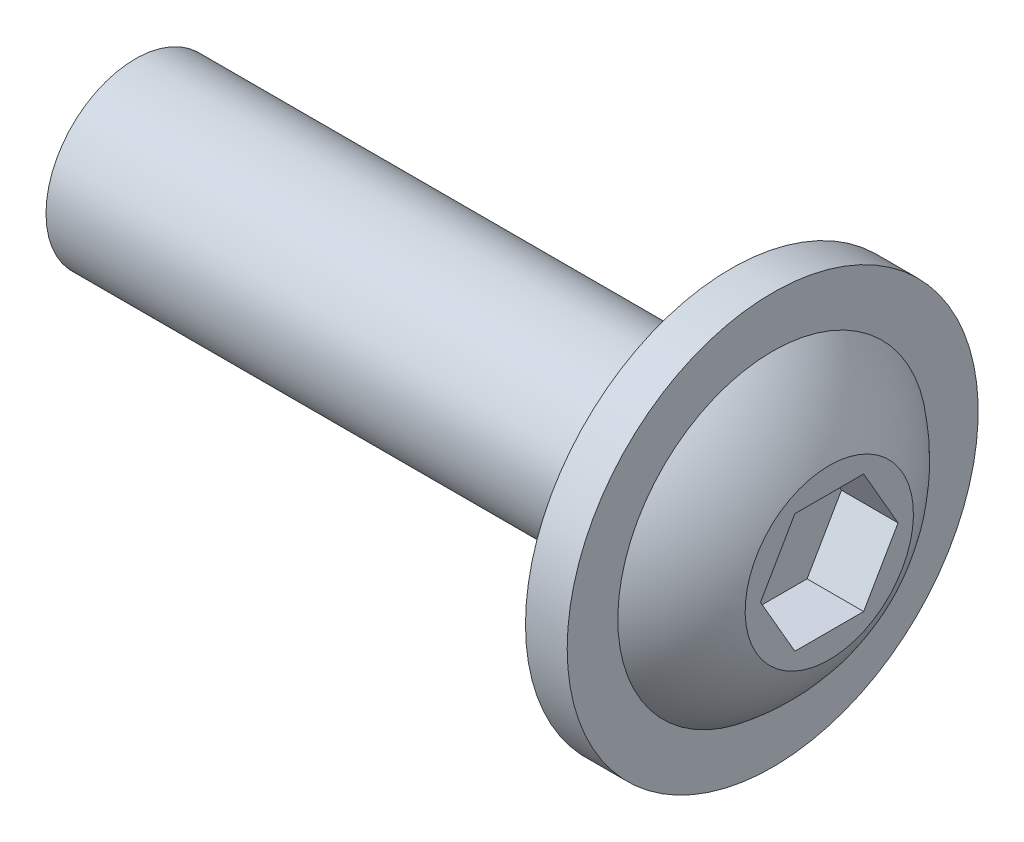
ISO-10303-21;
HEADER;
FILE_DESCRIPTION(('STEP AP214'),'2;1');
FILE_NAME('part.step','',(''),(''),'','','');
FILE_SCHEMA(('AUTOMOTIVE_DESIGN { 1 0 10303 214 1 1 1 1 }'));
ENDSEC;
DATA;
#1=APPLICATION_CONTEXT('core data for automotive mechanical design processes');
#2=APPLICATION_PROTOCOL_DEFINITION('international standard','automotive_design',2000,#1);
#3=PRODUCT_CONTEXT('',#1,'mechanical');
#4=PRODUCT('Part','Part','',(#3));
#5=PRODUCT_RELATED_PRODUCT_CATEGORY('part','',(#4));
#6=PRODUCT_DEFINITION_FORMATION('','',#4);
#7=PRODUCT_DEFINITION_CONTEXT('part definition',#1,'design');
#8=PRODUCT_DEFINITION('design','',#6,#7);
#9=PRODUCT_DEFINITION_SHAPE('','',#8);
#10=(LENGTH_UNIT() NAMED_UNIT(*) SI_UNIT(.MILLI.,.METRE.));
#11=(NAMED_UNIT(*) PLANE_ANGLE_UNIT() SI_UNIT($,.RADIAN.));
#12=(NAMED_UNIT(*) SI_UNIT($,.STERADIAN.) SOLID_ANGLE_UNIT());
#13=UNCERTAINTY_MEASURE_WITH_UNIT(LENGTH_MEASURE(1.E-05),#10,'distance_accuracy_value','');
#14=(GEOMETRIC_REPRESENTATION_CONTEXT(3) GLOBAL_UNCERTAINTY_ASSIGNED_CONTEXT((#13)) GLOBAL_UNIT_ASSIGNED_CONTEXT((#10,
#11,#12)) REPRESENTATION_CONTEXT('',''));
#15=CARTESIAN_POINT('',(0.,0.,0.));
#16=DIRECTION('',(0.,0.,1.));
#17=DIRECTION('',(1.,0.,0.));
#18=AXIS2_PLACEMENT_3D('',#15,#16,#17);
#19=CARTESIAN_POINT('',(-11.65,1.5,0.));
#20=DIRECTION('',(1.,0.,0.));
#21=DIRECTION('',(0.,0.,-1.));
#22=AXIS2_PLACEMENT_3D('',#19,#20,#21);
#23=PLANE('',#22);
#24=CARTESIAN_POINT('',(-11.65,0.,0.));
#25=DIRECTION('',(-1.,0.,0.));
#26=DIRECTION('',(0.,0.,1.));
#27=AXIS2_PLACEMENT_3D('',#24,#25,#26);
#28=CIRCLE('',#27,1.5);
#29=CARTESIAN_POINT('',(-11.65,0.,1.5));
#30=VERTEX_POINT('',#29);
#31=EDGE_CURVE('E11',#30,#30,#28,.T.);
#32=ORIENTED_EDGE('',*,*,#31,.T.);
#33=EDGE_LOOP('',(#32));
#34=FACE_BOUND('',#33,.T.);
#35=ADVANCED_FACE('F39',(#34),#23,.F.);
#36=CARTESIAN_POINT('',(0.,0.,0.));
#37=DIRECTION('',(-1.,0.,0.));
#38=DIRECTION('',(0.,0.,1.));
#39=AXIS2_PLACEMENT_3D('',#36,#37,#38);
#40=CYLINDRICAL_SURFACE('',#39,1.5);
#41=ORIENTED_EDGE('',*,*,#31,.F.);
#42=EDGE_LOOP('',(#41));
#43=FACE_BOUND('',#42,.T.);
#44=CARTESIAN_POINT('',(-1.65,0.,0.));
#45=DIRECTION('',(-1.,0.,0.));
#46=DIRECTION('',(0.,0.,1.));
#47=AXIS2_PLACEMENT_3D('',#44,#45,#46);
#48=CIRCLE('',#47,1.5);
#49=CARTESIAN_POINT('',(-1.65,0.,1.5));
#50=VERTEX_POINT('',#49);
#51=EDGE_CURVE('E46',#50,#50,#48,.T.);
#52=ORIENTED_EDGE('',*,*,#51,.T.);
#53=EDGE_LOOP('',(#52));
#54=FACE_BOUND('',#53,.T.);
#55=ADVANCED_FACE('F162',(#43,#54),#40,.T.);
#56=CARTESIAN_POINT('',(-1.65,3.45,0.));
#57=DIRECTION('',(1.,0.,0.));
#58=DIRECTION('',(0.,0.,-1.));
#59=AXIS2_PLACEMENT_3D('',#56,#57,#58);
#60=PLANE('',#59);
#61=ORIENTED_EDGE('',*,*,#51,.F.);
#62=EDGE_LOOP('',(#61));
#63=FACE_BOUND('',#62,.T.);
#64=CARTESIAN_POINT('',(-1.65,0.,0.));
#65=DIRECTION('',(-1.,0.,0.));
#66=DIRECTION('',(0.,0.,1.));
#67=AXIS2_PLACEMENT_3D('',#64,#65,#66);
#68=CIRCLE('',#67,3.45);
#69=CARTESIAN_POINT('',(-1.65,0.,3.45));
#70=VERTEX_POINT('',#69);
#71=EDGE_CURVE('E157',#70,#70,#68,.T.);
#72=ORIENTED_EDGE('',*,*,#71,.T.);
#73=EDGE_LOOP('',(#72));
#74=FACE_BOUND('',#73,.T.);
#75=ADVANCED_FACE('F164',(#63,#74),#60,.F.);
#76=CARTESIAN_POINT('',(0.,0.,0.));
#77=DIRECTION('',(-1.,0.,0.));
#78=DIRECTION('',(0.,0.,1.));
#79=AXIS2_PLACEMENT_3D('',#76,#77,#78);
#80=CYLINDRICAL_SURFACE('',#79,3.45);
#81=ORIENTED_EDGE('',*,*,#71,.F.);
#82=EDGE_LOOP('',(#81));
#83=FACE_BOUND('',#82,.T.);
#84=CARTESIAN_POINT('',(-0.95,0.,0.));
#85=DIRECTION('',(-1.,0.,0.));
#86=DIRECTION('',(0.,0.,1.));
#87=AXIS2_PLACEMENT_3D('',#84,#85,#86);
#88=CIRCLE('',#87,3.45);
#89=CARTESIAN_POINT('',(-0.95,0.,3.45));
#90=VERTEX_POINT('',#89);
#91=EDGE_CURVE('E154',#90,#90,#88,.T.);
#92=ORIENTED_EDGE('',*,*,#91,.T.);
#93=EDGE_LOOP('',(#92));
#94=FACE_BOUND('',#93,.T.);
#95=ADVANCED_FACE('F167',(#83,#94),#80,.T.);
#96=CARTESIAN_POINT('',(-0.95,2.6,0.));
#97=DIRECTION('',(-1.,0.,0.));
#98=DIRECTION('',(0.,0.,1.));
#99=AXIS2_PLACEMENT_3D('',#96,#97,#98);
#100=PLANE('',#99);
#101=ORIENTED_EDGE('',*,*,#91,.F.);
#102=EDGE_LOOP('',(#101));
#103=FACE_BOUND('',#102,.T.);
#104=CARTESIAN_POINT('',(-0.95,0.,0.));
#105=DIRECTION('',(-1.,0.,0.));
#106=DIRECTION('',(0.,0.,1.));
#107=AXIS2_PLACEMENT_3D('',#104,#105,#106);
#108=CIRCLE('',#107,2.6);
#109=CARTESIAN_POINT('',(-0.95,2.6,0.));
#110=VERTEX_POINT('',#109);
#111=EDGE_CURVE('E151',#110,#110,#108,.T.);
#112=ORIENTED_EDGE('',*,*,#111,.T.);
#113=EDGE_LOOP('',(#112));
#114=FACE_BOUND('',#113,.T.);
#115=ADVANCED_FACE('F173',(#103,#114),#100,.F.);
#116=CARTESIAN_POINT('',(-2.98224014329016,0.,0.));
#117=DIRECTION('',(-1.,0.,0.));
#118=DIRECTION('',(0.,1.,0.));
#119=AXIS2_PLACEMENT_3D('',#116,#117,#118);
#120=SPHERICAL_SURFACE('',#119,3.3);
#121=CARTESIAN_POINT('',(0.,0.,0.));
#122=DIRECTION('',(-1.,0.,0.));
#123=DIRECTION('',(0.,0.,1.));
#124=AXIS2_PLACEMENT_3D('',#121,#122,#123);
#125=CIRCLE('',#124,1.41288489543512);
#126=CARTESIAN_POINT('',(0.,1.41288489543512,0.));
#127=VERTEX_POINT('',#126);
#128=EDGE_CURVE('E148',#127,#127,#125,.T.);
#129=CARTESIAN_POINT('',(-0.95,2.6,0.));
#130=CARTESIAN_POINT('',(-0.937408529744916,2.59015812989321,0.));
#131=CARTESIAN_POINT('',(-0.924888564719277,2.58022477804573,0.));
#132=CARTESIAN_POINT('',(-0.899994263559137,2.56017723767448,0.));
#133=CARTESIAN_POINT('',(-0.887619927424636,2.55006304915072,0.));
#134=CARTESIAN_POINT('',(-0.86301950247902,2.52965596223195,0.));
#135=CARTESIAN_POINT('',(-0.850793413667905,2.51936306383696,0.));
#136=CARTESIAN_POINT('',(-0.826492062273263,2.49860073193008,0.));
#137=CARTESIAN_POINT('',(-0.814416799689737,2.48813129841819,0.));
#138=CARTESIAN_POINT('',(-0.790419650025498,2.46701810555383,0.));
#139=CARTESIAN_POINT('',(-0.778497762944786,2.45637434620135,0.));
#140=CARTESIAN_POINT('',(-0.754809880596026,2.43491474846258,0.));
#141=CARTESIAN_POINT('',(-0.743043885327979,2.42409891007628,0.));
#142=CARTESIAN_POINT('',(-0.719670270167692,2.4022974372018,0.));
#143=CARTESIAN_POINT('',(-0.708062650275453,2.3913118027136,0.));
#144=CARTESIAN_POINT('',(-0.685008235958089,2.36917305646,0.));
#145=CARTESIAN_POINT('',(-0.673561441532963,2.35801994469459,0.));
#146=CARTESIAN_POINT('',(-0.65083109430597,2.33554859804768,0.));
#147=CARTESIAN_POINT('',(-0.639547541504101,2.32423036316618,0.));
#148=CARTESIAN_POINT('',(-0.617146059220181,2.30143115930568,0.));
#149=CARTESIAN_POINT('',(-0.60602812973813,2.28995019032668,0.));
#150=CARTESIAN_POINT('',(-0.583960240831968,2.26682794163817,0.));
#151=CARTESIAN_POINT('',(-0.573010281407856,2.25518666192866,0.));
#152=CARTESIAN_POINT('',(-0.551280643900881,2.23174624898426,0.));
#153=CARTESIAN_POINT('',(-0.540500965818016,2.21994711574937,0.));
#154=CARTESIAN_POINT('',(-0.519114166334444,2.19619348627853,0.));
#155=CARTESIAN_POINT('',(-0.508507044933736,2.18423899004258,0.));
#156=CARTESIAN_POINT('',(-0.487467597732644,2.16017715788747,0.));
#157=CARTESIAN_POINT('',(-0.47703527193226,2.14806982196831,0.));
#158=CARTESIAN_POINT('',(-0.456347617954675,2.12370486602556,0.));
#159=CARTESIAN_POINT('',(-0.446092289777474,2.11144724600197,0.));
#160=CARTESIAN_POINT('',(-0.425760795709007,2.08678430915065,0.));
#161=CARTESIAN_POINT('',(-0.41568462981774,2.07437899232291,0.));
#162=CARTESIAN_POINT('',(-0.395713587166876,2.04942328033897,0.));
#163=CARTESIAN_POINT('',(-0.385818710407278,2.03687288518275,0.));
#164=CARTESIAN_POINT('',(-0.366212334599539,2.01162966564019,0.));
#165=CARTESIAN_POINT('',(-0.356500835551397,1.99893684125384,0.));
#166=CARTESIAN_POINT('',(-0.337263265039563,1.97341144241287,0.));
#167=CARTESIAN_POINT('',(-0.32773719357587,1.96057886795825,0.));
#168=CARTESIAN_POINT('',(-0.308872488966446,1.93477667764061,0.));
#169=CARTESIAN_POINT('',(-0.299533855820715,1.92180706177759,0.));
#170=CARTESIAN_POINT('',(-0.281045999016836,1.89573352622931,0.));
#171=CARTESIAN_POINT('',(-0.271896775358689,1.88262960654404,0.));
#172=CARTESIAN_POINT('',(-0.253789668719612,1.85629022928584,0.));
#173=CARTESIAN_POINT('',(-0.244831785738683,1.84305477171292,0.));
#174=CARTESIAN_POINT('',(-0.227109251256168,1.81645511237855,0.));
#175=CARTESIAN_POINT('',(-0.218344599754581,1.80309091061712,0.));
#176=CARTESIAN_POINT('',(-0.201010378245862,1.77623658377998,0.));
#177=CARTESIAN_POINT('',(-0.19244080823873,1.76274645870427,0.));
#178=CARTESIAN_POINT('',(-0.175498558558005,1.73564313269174,0.));
#179=CARTESIAN_POINT('',(-0.167125878884413,1.72202993175492,0.));
#180=CARTESIAN_POINT('',(-0.150579177146493,1.69468332745394,0.));
#181=CARTESIAN_POINT('',(-0.142405155082165,1.68094992408978,0.));
#182=CARTESIAN_POINT('',(-0.126257493922748,1.65336581373184,0.));
#183=CARTESIAN_POINT('',(-0.118283854827658,1.63951510673807,0.));
#184=CARTESIAN_POINT('',(-0.102538642609729,1.61169931270858,0.));
#185=CARTESIAN_POINT('',(-0.0947670694868906,1.59773422567286,0.));
#186=CARTESIAN_POINT('',(-0.0794276297917278,1.56969261917869,0.));
#187=CARTESIAN_POINT('',(-0.0718597632194037,1.55561609972023,0.));
#188=CARTESIAN_POINT('',(-0.0569293333597045,1.52735459993657,0.));
#189=CARTESIAN_POINT('',(-0.0495667700723295,1.51316961961137,0.));
#190=CARTESIAN_POINT('',(-0.035048503339819,1.48469419099126,0.));
#191=CARTESIAN_POINT('',(-0.0278927998946835,1.47040374269636,0.));
#192=CARTESIAN_POINT('',(-0.0137897539561572,1.44172039908994,0.));
#193=CARTESIAN_POINT('',(-0.00684241146276627,1.42732750377841,0.));
#194=CARTESIAN_POINT('',(0.,1.41288489543512,0.));
#195=B_SPLINE_CURVE_WITH_KNOTS('',3,(#129,#130,#131,#132,#133,#134,#135,#136,#137,#138,#139,
#140,#141,#142,#143,#144,#145,#146,#147,#148,#149,#150,#151,#152,#153,#154,#155,#156,#157,#158,
#159,#160,#161,#162,#163,#164,#165,#166,#167,#168,#169,#170,#171,#172,#173,#174,#175,#176,#177,
#178,#179,#180,#181,#182,#183,#184,#185,#186,#187,#188,#189,#190,#191,#192,#193,#194),
.UNSPECIFIED.,.F.,.F.,(4,2,2,2,2,2,2,2,2,2,2,2,2,2,2,2,2,2,2,2,2,2,2,2,2,2,2,2,2,2,2,2,4),(0.,
0.0479440017563815,0.0958880035127624,0.143832005269143,0.191776007025525,0.239720008781907,
0.287664010538287,0.335608012294669,0.38355201405105,0.431496015807431,0.479440017563813,
0.527384019320194,0.575328021076575,0.623272022832957,0.671216024589337,0.719160026345719,
0.7671040281021,0.815048029858482,0.862992031614863,0.910936033371244,0.958880035127625,
1.00682403688401,1.05476803864039,1.10271204039677,1.15065604215315,1.19860004390953,
1.24654404566591,1.29448804742229,1.34243204917867,1.39037605093506,1.43832005269144,
1.48626405444782,1.5342080562042),.UNSPECIFIED.);
#196=EDGE_CURVE('BSEAM179',#110,#127,#195,.T.);
#197=ORIENTED_EDGE('',*,*,#111,.F.);
#198=ORIENTED_EDGE('',*,*,#128,.T.);
#199=ORIENTED_EDGE('',*,*,#196,.T.);
#200=ORIENTED_EDGE('',*,*,#196,.F.);
#201=EDGE_LOOP('',(#197,#199,#198,#200));
#202=FACE_BOUND('',#201,.T.);
#203=ADVANCED_FACE('F179',(#202),#120,.T.);
#204=CARTESIAN_POINT('',(0.,0.,0.));
#205=DIRECTION('',(-1.,0.,0.));
#206=DIRECTION('',(0.,0.,1.));
#207=AXIS2_PLACEMENT_3D('',#204,#205,#206);
#208=PLANE('',#207);
#209=DIRECTION('',(0.,0.,1.));
#210=VECTOR('',#209,1.);
#211=CARTESIAN_POINT('',(0.,1.,-0.577350269189625));
#212=LINE('',#211,#210);
#213=CARTESIAN_POINT('',(0.,1.,-0.577350269189625));
#214=VERTEX_POINT('',#213);
#215=CARTESIAN_POINT('',(0.,1.,0.577350269189626));
#216=VERTEX_POINT('',#215);
#217=EDGE_CURVE('E111',#214,#216,#212,.T.);
#218=ORIENTED_EDGE('',*,*,#217,.F.);
#219=DIRECTION('',(0.,0.866025403784438,0.5));
#220=VECTOR('',#219,1.);
#221=CARTESIAN_POINT('',(0.,0.,-1.15470053837925));
#222=LINE('',#221,#220);
#223=CARTESIAN_POINT('',(0.,0.,-1.15470053837925));
#224=VERTEX_POINT('',#223);
#225=EDGE_CURVE('E116',#224,#214,#222,.T.);
#226=ORIENTED_EDGE('',*,*,#225,.F.);
#227=DIRECTION('',(0.,0.866025403784439,-0.5));
#228=VECTOR('',#227,1.);
#229=CARTESIAN_POINT('',(0.,-1.,-0.577350269189626));
#230=LINE('',#229,#228);
#231=CARTESIAN_POINT('',(0.,-1.,-0.577350269189626));
#232=VERTEX_POINT('',#231);
#233=EDGE_CURVE('E127',#232,#224,#230,.T.);
#234=ORIENTED_EDGE('',*,*,#233,.F.);
#235=DIRECTION('',(0.,0.,-1.));
#236=VECTOR('',#235,1.);
#237=CARTESIAN_POINT('',(0.,-1.,0.577350269189626));
#238=LINE('',#237,#236);
#239=CARTESIAN_POINT('',(0.,-1.,0.577350269189626));
#240=VERTEX_POINT('',#239);
#241=EDGE_CURVE('E53',#240,#232,#238,.T.);
#242=ORIENTED_EDGE('',*,*,#241,.F.);
#243=DIRECTION('',(0.,-0.866025403784438,-0.5));
#244=VECTOR('',#243,1.);
#245=CARTESIAN_POINT('',(0.,0.,1.15470053837925));
#246=LINE('',#245,#244);
#247=CARTESIAN_POINT('',(0.,0.,1.15470053837925));
#248=VERTEX_POINT('',#247);
#249=EDGE_CURVE('E121',#248,#240,#246,.T.);
#250=ORIENTED_EDGE('',*,*,#249,.F.);
#251=DIRECTION('',(0.,-0.866025403784439,0.5));
#252=VECTOR('',#251,1.);
#253=CARTESIAN_POINT('',(0.,1.,0.577350269189626));
#254=LINE('',#253,#252);
#255=EDGE_CURVE('E105',#216,#248,#254,.T.);
#256=ORIENTED_EDGE('',*,*,#255,.F.);
#257=EDGE_LOOP('',(#218,#226,#234,#242,#250,#256));
#258=FACE_BOUND('',#257,.T.);
#259=ORIENTED_EDGE('',*,*,#128,.F.);
#260=EDGE_LOOP('',(#259));
#261=FACE_BOUND('',#260,.T.);
#262=ADVANCED_FACE('F118',(#258,#261),#208,.F.);
#263=CARTESIAN_POINT('',(-0.95,2.6,0.));
#264=DIRECTION('',(-1.,0.,0.));
#265=DIRECTION('',(0.,0.,1.));
#266=AXIS2_PLACEMENT_3D('',#263,#264,#265);
#267=PLANE('',#266);
#268=DIRECTION('',(0.,0.866025403784439,-0.5));
#269=VECTOR('',#268,1.);
#270=CARTESIAN_POINT('',(-0.95,-1.,-0.577350269189626));
#271=LINE('',#270,#269);
#272=CARTESIAN_POINT('',(-0.95,-1.,-0.577350269189626));
#273=VERTEX_POINT('',#272);
#274=CARTESIAN_POINT('',(-0.95,0.,-1.15470053837925));
#275=VERTEX_POINT('',#274);
#276=EDGE_CURVE('E130',#273,#275,#271,.T.);
#277=ORIENTED_EDGE('',*,*,#276,.T.);
#278=DIRECTION('',(0.,0.866025403784439,0.5));
#279=VECTOR('',#278,1.);
#280=CARTESIAN_POINT('',(-0.95,0.,-1.15470053837925));
#281=LINE('',#280,#279);
#282=CARTESIAN_POINT('',(-0.95,1.,-0.577350269189625));
#283=VERTEX_POINT('',#282);
#284=EDGE_CURVE('E85',#275,#283,#281,.T.);
#285=ORIENTED_EDGE('',*,*,#284,.T.);
#286=DIRECTION('',(0.,0.,1.));
#287=VECTOR('',#286,1.);
#288=CARTESIAN_POINT('',(-0.95,1.,-0.577350269189625));
#289=LINE('',#288,#287);
#290=CARTESIAN_POINT('',(-0.95,1.,0.577350269189626));
#291=VERTEX_POINT('',#290);
#292=EDGE_CURVE('E94',#283,#291,#289,.T.);
#293=ORIENTED_EDGE('',*,*,#292,.T.);
#294=DIRECTION('',(0.,-0.866025403784439,0.5));
#295=VECTOR('',#294,1.);
#296=CARTESIAN_POINT('',(-0.95,1.,0.577350269189626));
#297=LINE('',#296,#295);
#298=CARTESIAN_POINT('',(-0.95,0.,1.15470053837925));
#299=VERTEX_POINT('',#298);
#300=EDGE_CURVE('E108',#291,#299,#297,.T.);
#301=ORIENTED_EDGE('',*,*,#300,.T.);
#302=DIRECTION('',(0.,-0.866025403784439,-0.5));
#303=VECTOR('',#302,1.);
#304=CARTESIAN_POINT('',(-0.95,0.,1.15470053837925));
#305=LINE('',#304,#303);
#306=CARTESIAN_POINT('',(-0.95,-1.,0.577350269189626));
#307=VERTEX_POINT('',#306);
#308=EDGE_CURVE('E137',#299,#307,#305,.T.);
#309=ORIENTED_EDGE('',*,*,#308,.T.);
#310=DIRECTION('',(0.,0.,-1.));
#311=VECTOR('',#310,1.);
#312=CARTESIAN_POINT('',(-0.95,-1.,0.577350269189626));
#313=LINE('',#312,#311);
#314=EDGE_CURVE('E133',#307,#273,#313,.T.);
#315=ORIENTED_EDGE('',*,*,#314,.T.);
#316=EDGE_LOOP('',(#277,#285,#293,#301,#309,#315));
#317=FACE_BOUND('',#316,.T.);
#318=ADVANCED_FACE('F188',(#317),#267,.F.);
#319=CARTESIAN_POINT('',(-4.00505046330389,0.,-1.15470053837925));
#320=DIRECTION('',(0.,0.5,-0.866025403784438));
#321=DIRECTION('',(0.,0.866025403784439,0.5));
#322=AXIS2_PLACEMENT_3D('',#319,#320,#321);
#323=PLANE('',#322);
#324=DIRECTION('',(1.,0.,0.));
#325=VECTOR('',#324,1.);
#326=CARTESIAN_POINT('',(-4.00505046330389,0.,-1.15470053837925));
#327=LINE('',#326,#325);
#328=EDGE_CURVE('E62',#275,#224,#327,.T.);
#329=ORIENTED_EDGE('',*,*,#328,.T.);
#330=ORIENTED_EDGE('',*,*,#225,.T.);
#331=DIRECTION('',(1.,0.,0.));
#332=VECTOR('',#331,1.);
#333=CARTESIAN_POINT('',(-4.00505046330389,1.,-0.577350269189625));
#334=LINE('',#333,#332);
#335=EDGE_CURVE('E113',#283,#214,#334,.T.);
#336=ORIENTED_EDGE('',*,*,#335,.F.);
#337=ORIENTED_EDGE('',*,*,#284,.F.);
#338=EDGE_LOOP('',(#329,#330,#336,#337));
#339=FACE_BOUND('',#338,.T.);
#340=ADVANCED_FACE('F193',(#339),#323,.F.);
#341=CARTESIAN_POINT('',(-4.00505046330389,1.,-0.577350269189625));
#342=DIRECTION('',(0.,1.,0.));
#343=DIRECTION('',(0.,0.,1.));
#344=AXIS2_PLACEMENT_3D('',#341,#342,#343);
#345=PLANE('',#344);
#346=ORIENTED_EDGE('',*,*,#335,.T.);
#347=ORIENTED_EDGE('',*,*,#217,.T.);
#348=DIRECTION('',(1.,0.,0.));
#349=VECTOR('',#348,1.);
#350=CARTESIAN_POINT('',(-4.00505046330389,1.,0.577350269189626));
#351=LINE('',#350,#349);
#352=EDGE_CURVE('E100',#291,#216,#351,.T.);
#353=ORIENTED_EDGE('',*,*,#352,.F.);
#354=ORIENTED_EDGE('',*,*,#292,.F.);
#355=EDGE_LOOP('',(#346,#347,#353,#354));
#356=FACE_BOUND('',#355,.T.);
#357=ADVANCED_FACE('F112',(#356),#345,.F.);
#358=CARTESIAN_POINT('',(-4.00505046330389,1.,0.577350269189626));
#359=DIRECTION('',(0.,0.5,0.866025403784439));
#360=DIRECTION('',(0.,-0.866025403784439,0.5));
#361=AXIS2_PLACEMENT_3D('',#358,#359,#360);
#362=PLANE('',#361);
#363=ORIENTED_EDGE('',*,*,#352,.T.);
#364=ORIENTED_EDGE('',*,*,#255,.T.);
#365=DIRECTION('',(1.,0.,0.));
#366=VECTOR('',#365,1.);
#367=CARTESIAN_POINT('',(-4.00505046330389,0.,1.15470053837925));
#368=LINE('',#367,#366);
#369=EDGE_CURVE('E140',#299,#248,#368,.T.);
#370=ORIENTED_EDGE('',*,*,#369,.F.);
#371=ORIENTED_EDGE('',*,*,#300,.F.);
#372=EDGE_LOOP('',(#363,#364,#370,#371));
#373=FACE_BOUND('',#372,.T.);
#374=ADVANCED_FACE('F102',(#373),#362,.F.);
#375=CARTESIAN_POINT('',(-4.00505046330389,0.,1.15470053837925));
#376=DIRECTION('',(0.,-0.5,0.866025403784438));
#377=DIRECTION('',(0.,-0.866025403784439,-0.5));
#378=AXIS2_PLACEMENT_3D('',#375,#376,#377);
#379=PLANE('',#378);
#380=ORIENTED_EDGE('',*,*,#369,.T.);
#381=ORIENTED_EDGE('',*,*,#249,.T.);
#382=DIRECTION('',(1.,0.,0.));
#383=VECTOR('',#382,1.);
#384=CARTESIAN_POINT('',(-4.00505046330389,-1.,0.577350269189626));
#385=LINE('',#384,#383);
#386=EDGE_CURVE('E136',#307,#240,#385,.T.);
#387=ORIENTED_EDGE('',*,*,#386,.F.);
#388=ORIENTED_EDGE('',*,*,#308,.F.);
#389=EDGE_LOOP('',(#380,#381,#387,#388));
#390=FACE_BOUND('',#389,.T.);
#391=ADVANCED_FACE('F257',(#390),#379,.F.);
#392=CARTESIAN_POINT('',(-4.00505046330389,-1.,0.577350269189626));
#393=DIRECTION('',(0.,-1.,0.));
#394=DIRECTION('',(0.,0.,-1.));
#395=AXIS2_PLACEMENT_3D('',#392,#393,#394);
#396=PLANE('',#395);
#397=ORIENTED_EDGE('',*,*,#386,.T.);
#398=ORIENTED_EDGE('',*,*,#241,.T.);
#399=DIRECTION('',(1.,0.,0.));
#400=VECTOR('',#399,1.);
#401=CARTESIAN_POINT('',(-4.00505046330389,-1.,-0.577350269189626));
#402=LINE('',#401,#400);
#403=EDGE_CURVE('E132',#273,#232,#402,.T.);
#404=ORIENTED_EDGE('',*,*,#403,.F.);
#405=ORIENTED_EDGE('',*,*,#314,.F.);
#406=EDGE_LOOP('',(#397,#398,#404,#405));
#407=FACE_BOUND('',#406,.T.);
#408=ADVANCED_FACE('F266',(#407),#396,.F.);
#409=CARTESIAN_POINT('',(-4.00505046330389,-1.,-0.577350269189626));
#410=DIRECTION('',(0.,-0.5,-0.866025403784439));
#411=DIRECTION('',(0.,0.866025403784439,-0.5));
#412=AXIS2_PLACEMENT_3D('',#409,#410,#411);
#413=PLANE('',#412);
#414=ORIENTED_EDGE('',*,*,#403,.T.);
#415=ORIENTED_EDGE('',*,*,#233,.T.);
#416=ORIENTED_EDGE('',*,*,#328,.F.);
#417=ORIENTED_EDGE('',*,*,#276,.F.);
#418=EDGE_LOOP('',(#414,#415,#416,#417));
#419=FACE_BOUND('',#418,.T.);
#420=ADVANCED_FACE('F276',(#419),#413,.F.);
#421=CLOSED_SHELL('',(#35,#55,#75,#95,#115,#203,#262,#318,#340,#357,#374,#391,#408,#420));
#422=MANIFOLD_SOLID_BREP('B2',#421);
#423=ADVANCED_BREP_SHAPE_REPRESENTATION('',(#18,#422),#14);
#424=SHAPE_DEFINITION_REPRESENTATION(#9,#423);
ENDSEC;
END-ISO-10303-21;
